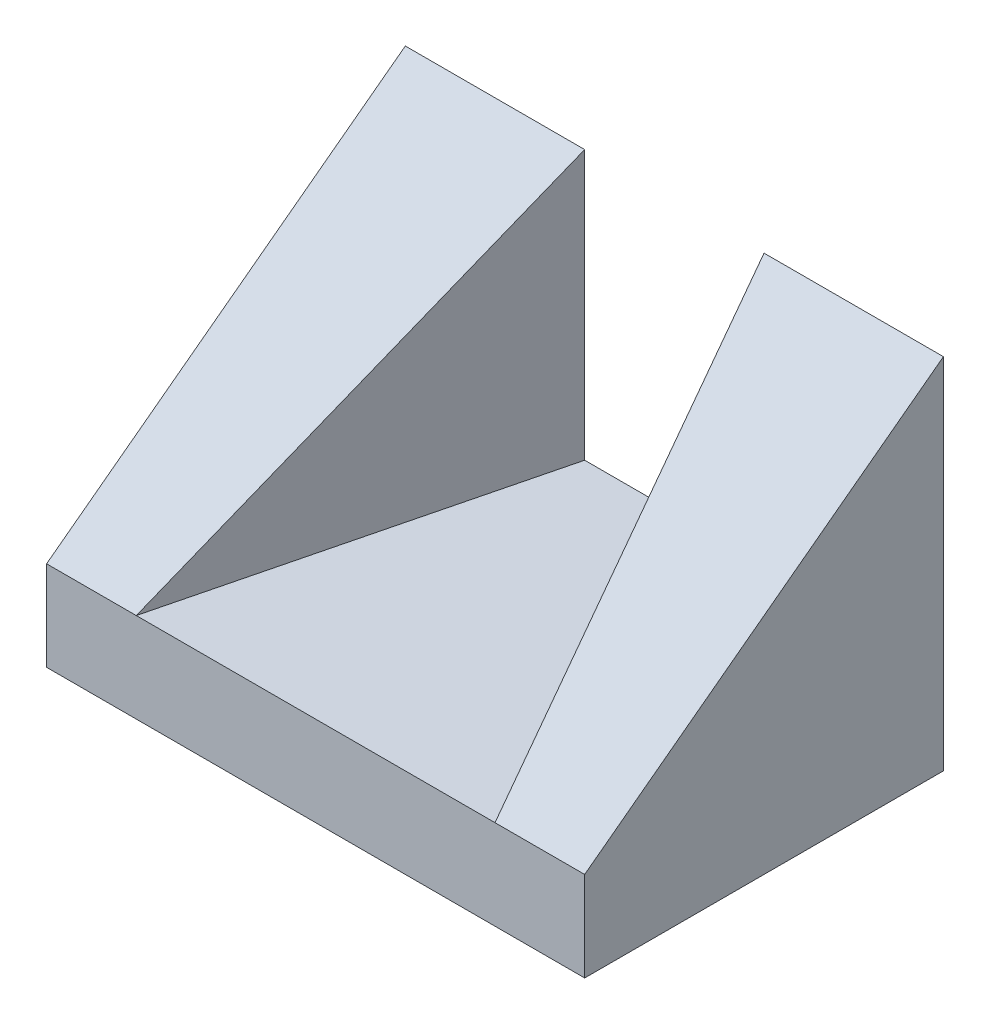
ISO-10303-21;
HEADER;
FILE_DESCRIPTION(('STEP AP214'),'2;1');
FILE_NAME('part.step','',(''),(''),'','','');
FILE_SCHEMA(('AUTOMOTIVE_DESIGN { 1 0 10303 214 1 1 1 1 }'));
ENDSEC;
DATA;
#1=APPLICATION_CONTEXT('core data for automotive mechanical design processes');
#2=APPLICATION_PROTOCOL_DEFINITION('international standard','automotive_design',2000,#1);
#3=PRODUCT_CONTEXT('',#1,'mechanical');
#4=PRODUCT('Part','Part','',(#3));
#5=PRODUCT_RELATED_PRODUCT_CATEGORY('part','',(#4));
#6=PRODUCT_DEFINITION_FORMATION('','',#4);
#7=PRODUCT_DEFINITION_CONTEXT('part definition',#1,'design');
#8=PRODUCT_DEFINITION('design','',#6,#7);
#9=PRODUCT_DEFINITION_SHAPE('','',#8);
#10=(LENGTH_UNIT() NAMED_UNIT(*) SI_UNIT(.MILLI.,.METRE.));
#11=(NAMED_UNIT(*) PLANE_ANGLE_UNIT() SI_UNIT($,.RADIAN.));
#12=(NAMED_UNIT(*) SI_UNIT($,.STERADIAN.) SOLID_ANGLE_UNIT());
#13=UNCERTAINTY_MEASURE_WITH_UNIT(LENGTH_MEASURE(1.E-05),#10,'distance_accuracy_value','');
#14=(GEOMETRIC_REPRESENTATION_CONTEXT(3) GLOBAL_UNCERTAINTY_ASSIGNED_CONTEXT((#13)) GLOBAL_UNIT_ASSIGNED_CONTEXT((#10,
#11,#12)) REPRESENTATION_CONTEXT('',''));
#15=CARTESIAN_POINT('',(0.,0.,0.));
#16=DIRECTION('',(0.,0.,1.));
#17=DIRECTION('',(1.,0.,0.));
#18=AXIS2_PLACEMENT_3D('',#15,#16,#17);
#19=CARTESIAN_POINT('',(30.,-30.,40.));
#20=DIRECTION('',(0.,-0.8,-0.6));
#21=DIRECTION('',(0.,0.6,-0.8));
#22=AXIS2_PLACEMENT_3D('',#19,#20,#21);
#23=PLANE('',#22);
#24=DIRECTION('',(-1.,0.,0.));
#25=VECTOR('',#24,1.);
#26=CARTESIAN_POINT('',(30.,-30.,40.));
#27=LINE('',#26,#25);
#28=CARTESIAN_POINT('',(-20.,-30.,40.));
#29=VERTEX_POINT('',#28);
#30=CARTESIAN_POINT('',(-30.,-30.,40.));
#31=VERTEX_POINT('',#30);
#32=EDGE_CURVE('E126',#29,#31,#27,.T.);
#33=ORIENTED_EDGE('',*,*,#32,.F.);
#34=DIRECTION('',(0.196116135138184,0.588348405414552,-0.784464540552736));
#35=VECTOR('',#34,1.);
#36=CARTESIAN_POINT('',(-18.0769230769231,-24.2307692307692,32.3076923076923));
#37=LINE('',#36,#35);
#38=CARTESIAN_POINT('',(-10.,0.,0.));
#39=VERTEX_POINT('',#38);
#40=EDGE_CURVE('E11',#29,#39,#37,.T.);
#41=ORIENTED_EDGE('',*,*,#40,.T.);
#42=DIRECTION('',(-1.,0.,0.));
#43=VECTOR('',#42,1.);
#44=CARTESIAN_POINT('',(30.,0.,0.));
#45=LINE('',#44,#43);
#46=CARTESIAN_POINT('',(-30.,0.,0.));
#47=VERTEX_POINT('',#46);
#48=EDGE_CURVE('E84',#39,#47,#45,.T.);
#49=ORIENTED_EDGE('',*,*,#48,.T.);
#50=DIRECTION('',(0.,-0.6,0.8));
#51=VECTOR('',#50,1.);
#52=CARTESIAN_POINT('',(-30.,-30.,40.));
#53=LINE('',#52,#51);
#54=EDGE_CURVE('E144',#47,#31,#53,.T.);
#55=ORIENTED_EDGE('',*,*,#54,.T.);
#56=EDGE_LOOP('',(#33,#41,#49,#55));
#57=FACE_BOUND('',#56,.T.);
#58=ADVANCED_FACE('F39',(#57),#23,.F.);
#59=CARTESIAN_POINT('',(30.,0.,0.));
#60=VERTEX_POINT('',#59);
#61=CARTESIAN_POINT('',(10.,0.,0.));
#62=VERTEX_POINT('',#61);
#63=EDGE_CURVE('E128',#60,#62,#45,.T.);
#64=ORIENTED_EDGE('',*,*,#63,.T.);
#65=DIRECTION('',(0.196116135138184,-0.588348405414552,0.784464540552736));
#66=VECTOR('',#65,1.);
#67=CARTESIAN_POINT('',(20.3846153846154,-31.1538461538462,41.5384615384615));
#68=LINE('',#67,#66);
#69=CARTESIAN_POINT('',(20.,-30.,40.));
#70=VERTEX_POINT('',#69);
#71=EDGE_CURVE('E50',#62,#70,#68,.T.);
#72=ORIENTED_EDGE('',*,*,#71,.T.);
#73=CARTESIAN_POINT('',(30.,-30.,40.));
#74=VERTEX_POINT('',#73);
#75=EDGE_CURVE('E124',#74,#70,#27,.T.);
#76=ORIENTED_EDGE('',*,*,#75,.F.);
#77=DIRECTION('',(0.,-0.6,0.8));
#78=VECTOR('',#77,1.);
#79=CARTESIAN_POINT('',(30.,-30.,40.));
#80=LINE('',#79,#78);
#81=EDGE_CURVE('E139',#60,#74,#80,.T.);
#82=ORIENTED_EDGE('',*,*,#81,.F.);
#83=EDGE_LOOP('',(#64,#72,#76,#82));
#84=FACE_BOUND('',#83,.T.);
#85=ADVANCED_FACE('F41',(#84),#23,.F.);
#86=CARTESIAN_POINT('',(30.,-40.,40.));
#87=DIRECTION('',(0.,0.,-1.));
#88=DIRECTION('',(-1.,0.,0.));
#89=AXIS2_PLACEMENT_3D('',#86,#87,#88);
#90=PLANE('',#89);
#91=DIRECTION('',(0.,-1.,0.));
#92=VECTOR('',#91,1.);
#93=CARTESIAN_POINT('',(-30.,-40.,40.));
#94=LINE('',#93,#92);
#95=CARTESIAN_POINT('',(-30.,-40.,40.));
#96=VERTEX_POINT('',#95);
#97=EDGE_CURVE('E142',#31,#96,#94,.T.);
#98=ORIENTED_EDGE('',*,*,#97,.T.);
#99=DIRECTION('',(-1.,0.,0.));
#100=VECTOR('',#99,1.);
#101=CARTESIAN_POINT('',(30.,-40.,40.));
#102=LINE('',#101,#100);
#103=CARTESIAN_POINT('',(30.,-40.,40.));
#104=VERTEX_POINT('',#103);
#105=EDGE_CURVE('E127',#104,#96,#102,.T.);
#106=ORIENTED_EDGE('',*,*,#105,.F.);
#107=DIRECTION('',(0.,-1.,0.));
#108=VECTOR('',#107,1.);
#109=CARTESIAN_POINT('',(30.,-40.,40.));
#110=LINE('',#109,#108);
#111=EDGE_CURVE('E95',#74,#104,#110,.T.);
#112=ORIENTED_EDGE('',*,*,#111,.F.);
#113=ORIENTED_EDGE('',*,*,#75,.T.);
#114=DIRECTION('',(1.,0.,0.));
#115=VECTOR('',#114,1.);
#116=CARTESIAN_POINT('',(20.,-30.,40.));
#117=LINE('',#116,#115);
#118=EDGE_CURVE('E115',#29,#70,#117,.T.);
#119=ORIENTED_EDGE('',*,*,#118,.F.);
#120=ORIENTED_EDGE('',*,*,#32,.T.);
#121=EDGE_LOOP('',(#98,#106,#112,#113,#119,#120));
#122=FACE_BOUND('',#121,.T.);
#123=ADVANCED_FACE('F130',(#122),#90,.F.);
#124=CARTESIAN_POINT('',(30.,-40.,0.));
#125=DIRECTION('',(0.,1.,0.));
#126=DIRECTION('',(0.,0.,1.));
#127=AXIS2_PLACEMENT_3D('',#124,#125,#126);
#128=PLANE('',#127);
#129=DIRECTION('',(0.,0.,-1.));
#130=VECTOR('',#129,1.);
#131=CARTESIAN_POINT('',(-30.,-40.,0.));
#132=LINE('',#131,#130);
#133=CARTESIAN_POINT('',(-30.,-40.,0.));
#134=VERTEX_POINT('',#133);
#135=EDGE_CURVE('E141',#96,#134,#132,.T.);
#136=ORIENTED_EDGE('',*,*,#135,.T.);
#137=DIRECTION('',(-1.,0.,0.));
#138=VECTOR('',#137,1.);
#139=CARTESIAN_POINT('',(30.,-40.,0.));
#140=LINE('',#139,#138);
#141=CARTESIAN_POINT('',(30.,-40.,0.));
#142=VERTEX_POINT('',#141);
#143=EDGE_CURVE('E132',#142,#134,#140,.T.);
#144=ORIENTED_EDGE('',*,*,#143,.F.);
#145=DIRECTION('',(0.,0.,-1.));
#146=VECTOR('',#145,1.);
#147=CARTESIAN_POINT('',(30.,-40.,0.));
#148=LINE('',#147,#146);
#149=EDGE_CURVE('E146',#104,#142,#148,.T.);
#150=ORIENTED_EDGE('',*,*,#149,.F.);
#151=ORIENTED_EDGE('',*,*,#105,.T.);
#152=EDGE_LOOP('',(#136,#144,#150,#151));
#153=FACE_BOUND('',#152,.T.);
#154=ADVANCED_FACE('F169',(#153),#128,.F.);
#155=CARTESIAN_POINT('',(30.,0.,0.));
#156=DIRECTION('',(0.,0.,1.));
#157=DIRECTION('',(1.,0.,0.));
#158=AXIS2_PLACEMENT_3D('',#155,#156,#157);
#159=PLANE('',#158);
#160=DIRECTION('',(-1.,0.,0.));
#161=VECTOR('',#160,1.);
#162=CARTESIAN_POINT('',(-10.,-30.,0.));
#163=LINE('',#162,#161);
#164=CARTESIAN_POINT('',(10.,-30.,0.));
#165=VERTEX_POINT('',#164);
#166=CARTESIAN_POINT('',(-10.,-30.,0.));
#167=VERTEX_POINT('',#166);
#168=EDGE_CURVE('E112',#165,#167,#163,.T.);
#169=ORIENTED_EDGE('',*,*,#168,.F.);
#170=DIRECTION('',(0.,1.,0.));
#171=VECTOR('',#170,1.);
#172=CARTESIAN_POINT('',(10.,-30.,0.));
#173=LINE('',#172,#171);
#174=EDGE_CURVE('E107',#165,#62,#173,.T.);
#175=ORIENTED_EDGE('',*,*,#174,.T.);
#176=ORIENTED_EDGE('',*,*,#63,.F.);
#177=DIRECTION('',(0.,1.,0.));
#178=VECTOR('',#177,1.);
#179=CARTESIAN_POINT('',(30.,0.,0.));
#180=LINE('',#179,#178);
#181=EDGE_CURVE('E61',#142,#60,#180,.T.);
#182=ORIENTED_EDGE('',*,*,#181,.F.);
#183=ORIENTED_EDGE('',*,*,#143,.T.);
#184=DIRECTION('',(0.,1.,0.));
#185=VECTOR('',#184,1.);
#186=CARTESIAN_POINT('',(-30.,0.,0.));
#187=LINE('',#186,#185);
#188=EDGE_CURVE('E138',#134,#47,#187,.T.);
#189=ORIENTED_EDGE('',*,*,#188,.T.);
#190=ORIENTED_EDGE('',*,*,#48,.F.);
#191=DIRECTION('',(0.,1.,0.));
#192=VECTOR('',#191,1.);
#193=CARTESIAN_POINT('',(-10.,-30.,0.));
#194=LINE('',#193,#192);
#195=EDGE_CURVE('E150',#167,#39,#194,.T.);
#196=ORIENTED_EDGE('',*,*,#195,.F.);
#197=EDGE_LOOP('',(#169,#175,#176,#182,#183,#189,#190,#196));
#198=FACE_BOUND('',#197,.T.);
#199=ADVANCED_FACE('F158',(#198),#159,.F.);
#200=CARTESIAN_POINT('',(30.,0.,0.));
#201=DIRECTION('',(-1.,0.,0.));
#202=DIRECTION('',(0.,0.,1.));
#203=AXIS2_PLACEMENT_3D('',#200,#201,#202);
#204=PLANE('',#203);
#205=ORIENTED_EDGE('',*,*,#81,.T.);
#206=ORIENTED_EDGE('',*,*,#111,.T.);
#207=ORIENTED_EDGE('',*,*,#149,.T.);
#208=ORIENTED_EDGE('',*,*,#181,.T.);
#209=EDGE_LOOP('',(#205,#206,#207,#208));
#210=FACE_BOUND('',#209,.T.);
#211=ADVANCED_FACE('F173',(#210),#204,.F.);
#212=CARTESIAN_POINT('',(-30.,0.,0.));
#213=DIRECTION('',(-1.,0.,0.));
#214=DIRECTION('',(0.,0.,1.));
#215=AXIS2_PLACEMENT_3D('',#212,#213,#214);
#216=PLANE('',#215);
#217=ORIENTED_EDGE('',*,*,#54,.F.);
#218=ORIENTED_EDGE('',*,*,#188,.F.);
#219=ORIENTED_EDGE('',*,*,#135,.F.);
#220=ORIENTED_EDGE('',*,*,#97,.F.);
#221=EDGE_LOOP('',(#217,#218,#219,#220));
#222=FACE_BOUND('',#221,.T.);
#223=ADVANCED_FACE('F167',(#222),#216,.T.);
#224=CARTESIAN_POINT('',(-10.,-30.,0.));
#225=DIRECTION('',(-0.970142500145332,0.,-0.242535625036333));
#226=DIRECTION('',(-0.242535625036333,0.,0.970142500145332));
#227=AXIS2_PLACEMENT_3D('',#224,#225,#226);
#228=PLANE('',#227);
#229=DIRECTION('',(-0.242535625036333,0.,0.970142500145332));
#230=VECTOR('',#229,1.);
#231=CARTESIAN_POINT('',(-10.,-30.,0.));
#232=LINE('',#231,#230);
#233=EDGE_CURVE('E116',#167,#29,#232,.T.);
#234=ORIENTED_EDGE('',*,*,#233,.F.);
#235=ORIENTED_EDGE('',*,*,#195,.T.);
#236=ORIENTED_EDGE('',*,*,#40,.F.);
#237=EDGE_LOOP('',(#234,#235,#236));
#238=FACE_BOUND('',#237,.T.);
#239=ADVANCED_FACE('F159',(#238),#228,.F.);
#240=CARTESIAN_POINT('',(10.,-30.,0.));
#241=DIRECTION('',(0.970142500145332,0.,-0.242535625036333));
#242=DIRECTION('',(-0.242535625036333,0.,-0.970142500145332));
#243=AXIS2_PLACEMENT_3D('',#240,#241,#242);
#244=PLANE('',#243);
#245=ORIENTED_EDGE('',*,*,#174,.F.);
#246=DIRECTION('',(-0.242535625036333,0.,-0.970142500145332));
#247=VECTOR('',#246,1.);
#248=CARTESIAN_POINT('',(10.,-30.,0.));
#249=LINE('',#248,#247);
#250=EDGE_CURVE('E53',#70,#165,#249,.T.);
#251=ORIENTED_EDGE('',*,*,#250,.F.);
#252=ORIENTED_EDGE('',*,*,#71,.F.);
#253=EDGE_LOOP('',(#245,#251,#252));
#254=FACE_BOUND('',#253,.T.);
#255=ADVANCED_FACE('F108',(#254),#244,.F.);
#256=CARTESIAN_POINT('',(0.,-30.,0.));
#257=DIRECTION('',(0.,1.,0.));
#258=DIRECTION('',(0.,0.,1.));
#259=AXIS2_PLACEMENT_3D('',#256,#257,#258);
#260=PLANE('',#259);
#261=ORIENTED_EDGE('',*,*,#118,.T.);
#262=ORIENTED_EDGE('',*,*,#250,.T.);
#263=ORIENTED_EDGE('',*,*,#168,.T.);
#264=ORIENTED_EDGE('',*,*,#233,.T.);
#265=EDGE_LOOP('',(#261,#262,#263,#264));
#266=FACE_BOUND('',#265,.T.);
#267=ADVANCED_FACE('F118',(#266),#260,.T.);
#268=CLOSED_SHELL('',(#58,#85,#123,#154,#199,#211,#223,#239,#255,#267));
#269=MANIFOLD_SOLID_BREP('B2',#268);
#270=ADVANCED_BREP_SHAPE_REPRESENTATION('',(#18,#269),#14);
#271=SHAPE_DEFINITION_REPRESENTATION(#9,#270);
ENDSEC;
END-ISO-10303-21;
